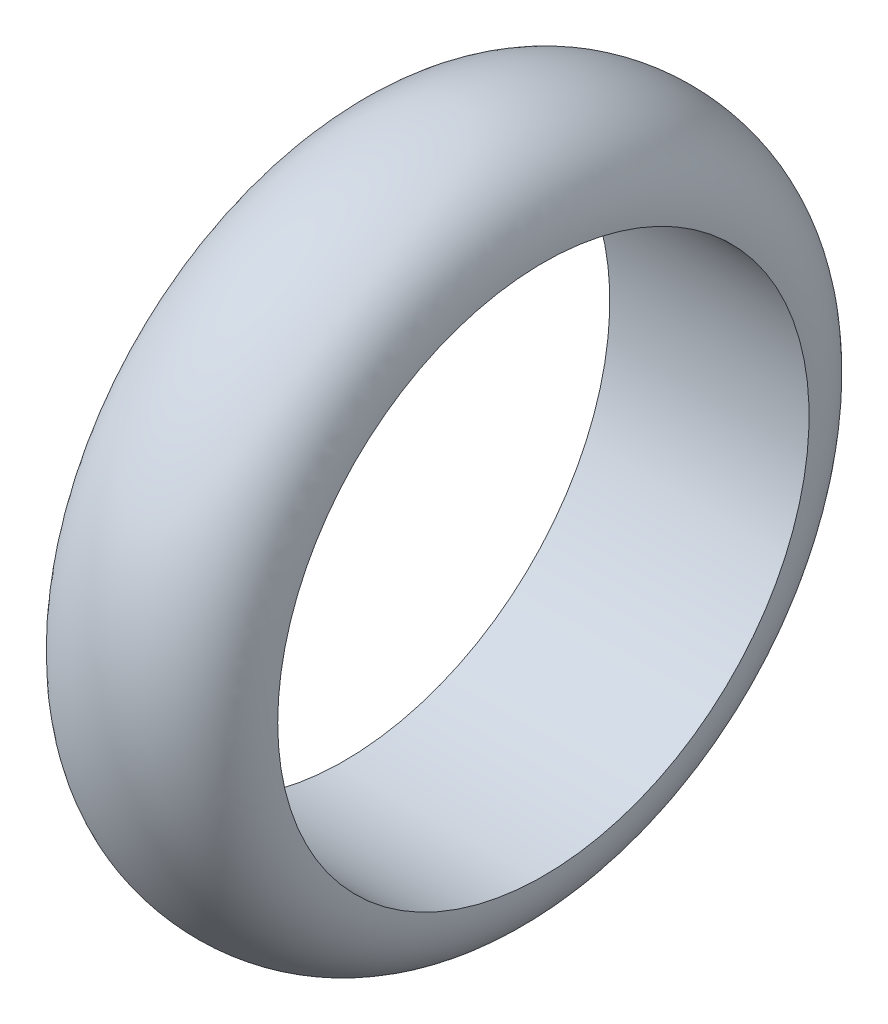
ISO-10303-21;
HEADER;
FILE_DESCRIPTION(('STEP AP214'),'2;1');
FILE_NAME('part.step','',(''),(''),'','','');
FILE_SCHEMA(('AUTOMOTIVE_DESIGN { 1 0 10303 214 1 1 1 1 }'));
ENDSEC;
DATA;
#1=APPLICATION_CONTEXT('core data for automotive mechanical design processes');
#2=APPLICATION_PROTOCOL_DEFINITION('international standard','automotive_design',2000,#1);
#3=PRODUCT_CONTEXT('',#1,'mechanical');
#4=PRODUCT('Part','Part','',(#3));
#5=PRODUCT_RELATED_PRODUCT_CATEGORY('part','',(#4));
#6=PRODUCT_DEFINITION_FORMATION('','',#4);
#7=PRODUCT_DEFINITION_CONTEXT('part definition',#1,'design');
#8=PRODUCT_DEFINITION('design','',#6,#7);
#9=PRODUCT_DEFINITION_SHAPE('','',#8);
#10=(LENGTH_UNIT() NAMED_UNIT(*) SI_UNIT(.MILLI.,.METRE.));
#11=(NAMED_UNIT(*) PLANE_ANGLE_UNIT() SI_UNIT($,.RADIAN.));
#12=(NAMED_UNIT(*) SI_UNIT($,.STERADIAN.) SOLID_ANGLE_UNIT());
#13=UNCERTAINTY_MEASURE_WITH_UNIT(LENGTH_MEASURE(1.E-05),#10,'distance_accuracy_value','');
#14=(GEOMETRIC_REPRESENTATION_CONTEXT(3) GLOBAL_UNCERTAINTY_ASSIGNED_CONTEXT((#13)) GLOBAL_UNIT_ASSIGNED_CONTEXT((#10,
#11,#12)) REPRESENTATION_CONTEXT('',''));
#15=CARTESIAN_POINT('',(0.,0.,0.));
#16=DIRECTION('',(0.,0.,1.));
#17=DIRECTION('',(1.,0.,0.));
#18=AXIS2_PLACEMENT_3D('',#15,#16,#17);
#19=CARTESIAN_POINT('',(0.,0.,-101.6));
#20=CARTESIAN_POINT('',(-1.44252831708123E-13,0.,-143.65316633136));
#21=CARTESIAN_POINT('',(76.2000000000002,0.,-144.278489033436));
#22=CARTESIAN_POINT('',(76.2,0.,-101.6));
#23=B_SPLINE_CURVE_WITH_KNOTS('',3,(#19,#20,#21,#22),.UNSPECIFIED.,.F.,.F.,(4,4),(0.,1.),.UNSPECIFIED.);
#24=CARTESIAN_POINT('',(0.,0.,0.));
#25=DIRECTION('',(-1.,0.,0.));
#26=AXIS1_PLACEMENT('',#24,#25);
#27=SURFACE_OF_REVOLUTION('',#23,#26);
#28=CARTESIAN_POINT('',(76.2,0.,0.));
#29=DIRECTION('',(-1.,0.,0.));
#30=DIRECTION('',(0.,0.,1.));
#31=AXIS2_PLACEMENT_3D('',#28,#29,#30);
#32=CIRCLE('',#31,101.6);
#33=CARTESIAN_POINT('',(76.2,0.,101.6));
#34=VERTEX_POINT('',#33);
#35=EDGE_CURVE('E47',#34,#34,#32,.T.);
#36=ORIENTED_EDGE('',*,*,#35,.T.);
#37=EDGE_LOOP('',(#36));
#38=FACE_BOUND('',#37,.T.);
#39=CARTESIAN_POINT('',(0.,0.,0.));
#40=DIRECTION('',(-1.,0.,0.));
#41=DIRECTION('',(0.,0.,1.));
#42=AXIS2_PLACEMENT_3D('',#39,#40,#41);
#43=CIRCLE('',#42,101.6);
#44=CARTESIAN_POINT('',(0.,0.,101.6));
#45=VERTEX_POINT('',#44);
#46=EDGE_CURVE('E10',#45,#45,#43,.T.);
#47=ORIENTED_EDGE('',*,*,#46,.F.);
#48=EDGE_LOOP('',(#47));
#49=FACE_BOUND('',#48,.T.);
#50=ADVANCED_FACE('F39',(#38,#49),#27,.F.);
#51=CARTESIAN_POINT('',(0.,0.,0.));
#52=DIRECTION('',(-1.,0.,0.));
#53=DIRECTION('',(0.,0.,1.));
#54=AXIS2_PLACEMENT_3D('',#51,#52,#53);
#55=CYLINDRICAL_SURFACE('',#54,101.6);
#56=ORIENTED_EDGE('',*,*,#35,.F.);
#57=EDGE_LOOP('',(#56));
#58=FACE_BOUND('',#57,.T.);
#59=ORIENTED_EDGE('',*,*,#46,.T.);
#60=EDGE_LOOP('',(#59));
#61=FACE_BOUND('',#60,.T.);
#62=ADVANCED_FACE('F62',(#58,#61),#55,.F.);
#63=CLOSED_SHELL('',(#50,#62));
#64=MANIFOLD_SOLID_BREP('B2',#63);
#65=ADVANCED_BREP_SHAPE_REPRESENTATION('',(#18,#64),#14);
#66=SHAPE_DEFINITION_REPRESENTATION(#9,#65);
ENDSEC;
END-ISO-10303-21;
